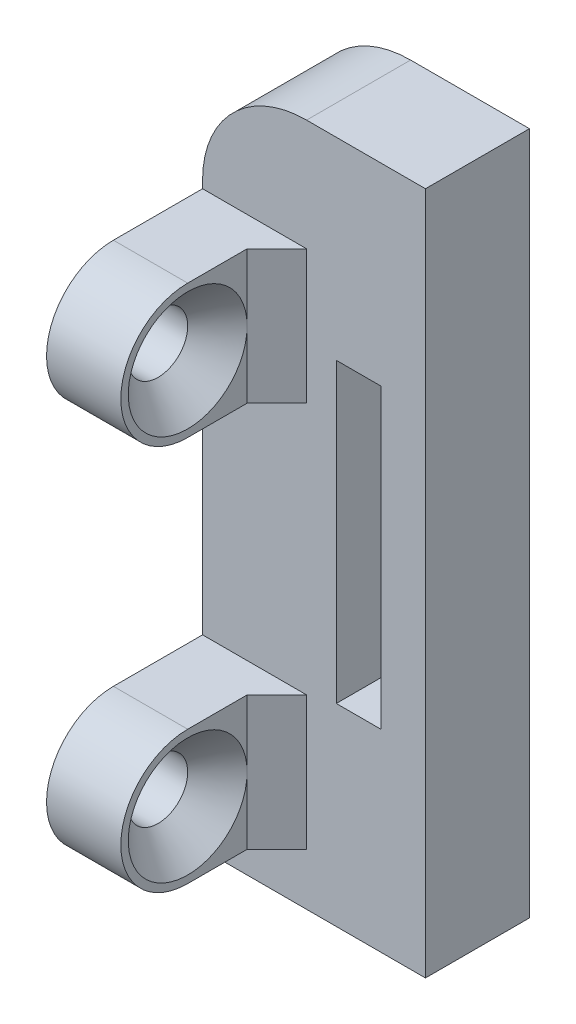
ISO-10303-21;
HEADER;
FILE_DESCRIPTION(('STEP AP214'),'2;1');
FILE_NAME('part.step','',(''),(''),'','','');
FILE_SCHEMA(('AUTOMOTIVE_DESIGN { 1 0 10303 214 1 1 1 1 }'));
ENDSEC;
DATA;
#1=APPLICATION_CONTEXT('core data for automotive mechanical design processes');
#2=APPLICATION_PROTOCOL_DEFINITION('international standard','automotive_design',2000,#1);
#3=PRODUCT_CONTEXT('',#1,'mechanical');
#4=PRODUCT('Part','Part','',(#3));
#5=PRODUCT_RELATED_PRODUCT_CATEGORY('part','',(#4));
#6=PRODUCT_DEFINITION_FORMATION('','',#4);
#7=PRODUCT_DEFINITION_CONTEXT('part definition',#1,'design');
#8=PRODUCT_DEFINITION('design','',#6,#7);
#9=PRODUCT_DEFINITION_SHAPE('','',#8);
#10=(LENGTH_UNIT() NAMED_UNIT(*) SI_UNIT(.MILLI.,.METRE.));
#11=(NAMED_UNIT(*) PLANE_ANGLE_UNIT() SI_UNIT($,.RADIAN.));
#12=(NAMED_UNIT(*) SI_UNIT($,.STERADIAN.) SOLID_ANGLE_UNIT());
#13=UNCERTAINTY_MEASURE_WITH_UNIT(LENGTH_MEASURE(1.E-05),#10,'distance_accuracy_value','');
#14=(GEOMETRIC_REPRESENTATION_CONTEXT(3) GLOBAL_UNCERTAINTY_ASSIGNED_CONTEXT((#13)) GLOBAL_UNIT_ASSIGNED_CONTEXT((#10,
#11,#12)) REPRESENTATION_CONTEXT('',''));
#15=CARTESIAN_POINT('',(0.,0.,0.));
#16=DIRECTION('',(0.,0.,1.));
#17=DIRECTION('',(1.,0.,0.));
#18=AXIS2_PLACEMENT_3D('',#15,#16,#17);
#19=CARTESIAN_POINT('',(14.,14.,7.));
#20=DIRECTION('',(0.,0.,1.));
#21=DIRECTION('',(1.,0.,0.));
#22=AXIS2_PLACEMENT_3D('',#19,#20,#21);
#23=PLANE('',#22);
#24=DIRECTION('',(0.,1.,0.));
#25=VECTOR('',#24,1.);
#26=CARTESIAN_POINT('',(19.,14.,7.));
#27=LINE('',#26,#25);
#28=CARTESIAN_POINT('',(19.,-12.,7.));
#29=VERTEX_POINT('',#28);
#30=CARTESIAN_POINT('',(19.,7.99999999999996,7.));
#31=VERTEX_POINT('',#30);
#32=EDGE_CURVE('E218',#29,#31,#27,.T.);
#33=ORIENTED_EDGE('',*,*,#32,.F.);
#34=DIRECTION('',(1.,0.,0.));
#35=VECTOR('',#34,1.);
#36=CARTESIAN_POINT('',(14.,-12.,7.));
#37=LINE('',#36,#35);
#38=CARTESIAN_POINT('',(16.,-12.,7.));
#39=VERTEX_POINT('',#38);
#40=EDGE_CURVE('E211',#39,#29,#37,.T.);
#41=ORIENTED_EDGE('',*,*,#40,.F.);
#42=DIRECTION('',(0.,-1.,0.));
#43=VECTOR('',#42,1.);
#44=CARTESIAN_POINT('',(16.,14.,7.));
#45=LINE('',#44,#43);
#46=CARTESIAN_POINT('',(16.,7.99999999999996,7.));
#47=VERTEX_POINT('',#46);
#48=EDGE_CURVE('E191',#47,#39,#45,.T.);
#49=ORIENTED_EDGE('',*,*,#48,.F.);
#50=DIRECTION('',(-1.,0.,0.));
#51=VECTOR('',#50,1.);
#52=CARTESIAN_POINT('',(14.,7.99999999999996,7.));
#53=LINE('',#52,#51);
#54=EDGE_CURVE('E216',#31,#47,#53,.T.);
#55=ORIENTED_EDGE('',*,*,#54,.F.);
#56=EDGE_LOOP('',(#33,#41,#49,#55));
#57=FACE_BOUND('',#56,.T.);
#58=DIRECTION('',(-1.,0.,0.));
#59=VECTOR('',#58,1.);
#60=CARTESIAN_POINT('',(12.,-12.5000000000001,7.));
#61=LINE('',#60,#59);
#62=CARTESIAN_POINT('',(14.,-12.5000000000001,7.));
#63=VERTEX_POINT('',#62);
#64=CARTESIAN_POINT('',(6.99999999999999,-12.5000000000001,7.));
#65=VERTEX_POINT('',#64);
#66=EDGE_CURVE('E237',#63,#65,#61,.T.);
#67=ORIENTED_EDGE('',*,*,#66,.F.);
#68=DIRECTION('',(0.,-1.,0.));
#69=VECTOR('',#68,1.);
#70=CARTESIAN_POINT('',(14.,-21.5000000000001,7.));
#71=LINE('',#70,#69);
#72=CARTESIAN_POINT('',(14.,-21.5000000000001,7.));
#73=VERTEX_POINT('',#72);
#74=EDGE_CURVE('E337',#63,#73,#71,.T.);
#75=ORIENTED_EDGE('',*,*,#74,.T.);
#76=DIRECTION('',(-1.,0.,0.));
#77=VECTOR('',#76,1.);
#78=CARTESIAN_POINT('',(12.,-21.5000000000001,7.));
#79=LINE('',#78,#77);
#80=CARTESIAN_POINT('',(6.99999999999999,-21.5000000000001,7.));
#81=VERTEX_POINT('',#80);
#82=EDGE_CURVE('E232',#73,#81,#79,.T.);
#83=ORIENTED_EDGE('',*,*,#82,.T.);
#84=DIRECTION('',(0.,-1.,0.));
#85=VECTOR('',#84,1.);
#86=CARTESIAN_POINT('',(6.99999999999999,13.9999999999999,7.));
#87=LINE('',#86,#85);
#88=CARTESIAN_POINT('',(6.99999999999999,-25.,7.));
#89=VERTEX_POINT('',#88);
#90=EDGE_CURVE('E286',#81,#89,#87,.T.);
#91=ORIENTED_EDGE('',*,*,#90,.T.);
#92=DIRECTION('',(1.,0.,0.));
#93=VECTOR('',#92,1.);
#94=CARTESIAN_POINT('',(6.99999999999999,-25.,7.));
#95=LINE('',#94,#93);
#96=CARTESIAN_POINT('',(22.,-25.,7.));
#97=VERTEX_POINT('',#96);
#98=EDGE_CURVE('E290',#89,#97,#95,.T.);
#99=ORIENTED_EDGE('',*,*,#98,.T.);
#100=DIRECTION('',(0.,1.,0.));
#101=VECTOR('',#100,1.);
#102=CARTESIAN_POINT('',(22.,-25.,7.));
#103=LINE('',#102,#101);
#104=CARTESIAN_POINT('',(22.,21.,7.));
#105=VERTEX_POINT('',#104);
#106=EDGE_CURVE('E278',#97,#105,#103,.T.);
#107=ORIENTED_EDGE('',*,*,#106,.T.);
#108=DIRECTION('',(-1.,0.,0.));
#109=VECTOR('',#108,1.);
#110=CARTESIAN_POINT('',(22.,21.,7.));
#111=LINE('',#110,#109);
#112=CARTESIAN_POINT('',(14.,21.,7.));
#113=VERTEX_POINT('',#112);
#114=EDGE_CURVE('E281',#105,#113,#111,.T.);
#115=ORIENTED_EDGE('',*,*,#114,.T.);
#116=CARTESIAN_POINT('',(14.,14.,7.));
#117=DIRECTION('',(0.,0.,1.));
#118=DIRECTION('',(1.,0.,0.));
#119=AXIS2_PLACEMENT_3D('',#116,#117,#118);
#120=CIRCLE('',#119,7.00000000000001);
#121=CARTESIAN_POINT('',(6.99999999999999,13.9999999999999,7.));
#122=VERTEX_POINT('',#121);
#123=EDGE_CURVE('E284',#113,#122,#120,.T.);
#124=ORIENTED_EDGE('',*,*,#123,.T.);
#125=CARTESIAN_POINT('',(6.99999999999999,13.4999999999999,7.));
#126=VERTEX_POINT('',#125);
#127=EDGE_CURVE('E287',#122,#126,#87,.T.);
#128=ORIENTED_EDGE('',*,*,#127,.T.);
#129=DIRECTION('',(-1.,0.,0.));
#130=VECTOR('',#129,1.);
#131=CARTESIAN_POINT('',(12.,13.4999999999999,7.));
#132=LINE('',#131,#130);
#133=CARTESIAN_POINT('',(14.,13.4999999999999,7.));
#134=VERTEX_POINT('',#133);
#135=EDGE_CURVE('E269',#134,#126,#132,.T.);
#136=ORIENTED_EDGE('',*,*,#135,.F.);
#137=DIRECTION('',(0.,-1.,0.));
#138=VECTOR('',#137,1.);
#139=CARTESIAN_POINT('',(14.,4.49999999999993,7.));
#140=LINE('',#139,#138);
#141=CARTESIAN_POINT('',(14.,4.49999999999993,7.));
#142=VERTEX_POINT('',#141);
#143=EDGE_CURVE('E334',#134,#142,#140,.T.);
#144=ORIENTED_EDGE('',*,*,#143,.T.);
#145=DIRECTION('',(-1.,0.,0.));
#146=VECTOR('',#145,1.);
#147=CARTESIAN_POINT('',(12.,4.49999999999993,7.));
#148=LINE('',#147,#146);
#149=CARTESIAN_POINT('',(6.99999999999999,4.49999999999993,7.));
#150=VERTEX_POINT('',#149);
#151=EDGE_CURVE('E261',#142,#150,#148,.T.);
#152=ORIENTED_EDGE('',*,*,#151,.T.);
#153=EDGE_CURVE('E291',#150,#65,#87,.T.);
#154=ORIENTED_EDGE('',*,*,#153,.T.);
#155=EDGE_LOOP('',(#67,#75,#83,#91,#99,#107,#115,#124,#128,#136,#144,#152,#154));
#156=FACE_BOUND('',#155,.T.);
#157=ADVANCED_FACE('F47',(#57,#156),#23,.T.);
#158=CARTESIAN_POINT('',(22.,-25.,7.));
#159=DIRECTION('',(-1.,0.,0.));
#160=DIRECTION('',(0.,0.,1.));
#161=AXIS2_PLACEMENT_3D('',#158,#159,#160);
#162=PLANE('',#161);
#163=DIRECTION('',(0.,1.,0.));
#164=VECTOR('',#163,1.);
#165=CARTESIAN_POINT('',(22.,-25.,0.));
#166=LINE('',#165,#164);
#167=CARTESIAN_POINT('',(22.,-25.,0.));
#168=VERTEX_POINT('',#167);
#169=CARTESIAN_POINT('',(22.,21.,0.));
#170=VERTEX_POINT('',#169);
#171=EDGE_CURVE('E271',#168,#170,#166,.T.);
#172=ORIENTED_EDGE('',*,*,#171,.T.);
#173=DIRECTION('',(0.,0.,-1.));
#174=VECTOR('',#173,1.);
#175=CARTESIAN_POINT('',(22.,21.,7.));
#176=LINE('',#175,#174);
#177=EDGE_CURVE('E314',#105,#170,#176,.T.);
#178=ORIENTED_EDGE('',*,*,#177,.F.);
#179=ORIENTED_EDGE('',*,*,#106,.F.);
#180=DIRECTION('',(0.,0.,-1.));
#181=VECTOR('',#180,1.);
#182=CARTESIAN_POINT('',(22.,-25.,7.));
#183=LINE('',#182,#181);
#184=EDGE_CURVE('E293',#97,#168,#183,.T.);
#185=ORIENTED_EDGE('',*,*,#184,.T.);
#186=EDGE_LOOP('',(#172,#178,#179,#185));
#187=FACE_BOUND('',#186,.T.);
#188=ADVANCED_FACE('F389',(#187),#162,.F.);
#189=CARTESIAN_POINT('',(22.,21.,7.));
#190=DIRECTION('',(0.,-1.,0.));
#191=DIRECTION('',(0.,0.,-1.));
#192=AXIS2_PLACEMENT_3D('',#189,#190,#191);
#193=PLANE('',#192);
#194=DIRECTION('',(-1.,0.,0.));
#195=VECTOR('',#194,1.);
#196=CARTESIAN_POINT('',(22.,21.,0.));
#197=LINE('',#196,#195);
#198=CARTESIAN_POINT('',(14.,21.,0.));
#199=VERTEX_POINT('',#198);
#200=EDGE_CURVE('E296',#170,#199,#197,.T.);
#201=ORIENTED_EDGE('',*,*,#200,.T.);
#202=DIRECTION('',(0.,0.,-1.));
#203=VECTOR('',#202,1.);
#204=CARTESIAN_POINT('',(14.,21.,7.));
#205=LINE('',#204,#203);
#206=EDGE_CURVE('E311',#113,#199,#205,.T.);
#207=ORIENTED_EDGE('',*,*,#206,.F.);
#208=ORIENTED_EDGE('',*,*,#114,.F.);
#209=ORIENTED_EDGE('',*,*,#177,.T.);
#210=EDGE_LOOP('',(#201,#207,#208,#209));
#211=FACE_BOUND('',#210,.T.);
#212=ADVANCED_FACE('F394',(#211),#193,.F.);
#213=CARTESIAN_POINT('',(14.,14.,7.));
#214=DIRECTION('',(0.,0.,-1.));
#215=DIRECTION('',(-1.,0.,0.));
#216=AXIS2_PLACEMENT_3D('',#213,#214,#215);
#217=CYLINDRICAL_SURFACE('',#216,7.00000000000001);
#218=CARTESIAN_POINT('',(14.,14.,0.));
#219=DIRECTION('',(0.,0.,1.));
#220=DIRECTION('',(1.,0.,0.));
#221=AXIS2_PLACEMENT_3D('',#218,#219,#220);
#222=CIRCLE('',#221,7.00000000000001);
#223=CARTESIAN_POINT('',(6.99999999999999,13.9999999999999,0.));
#224=VERTEX_POINT('',#223);
#225=EDGE_CURVE('E298',#199,#224,#222,.T.);
#226=ORIENTED_EDGE('',*,*,#225,.T.);
#227=DIRECTION('',(0.,0.,-1.));
#228=VECTOR('',#227,1.);
#229=CARTESIAN_POINT('',(6.99999999999999,13.9999999999999,7.));
#230=LINE('',#229,#228);
#231=EDGE_CURVE('E308',#122,#224,#230,.T.);
#232=ORIENTED_EDGE('',*,*,#231,.F.);
#233=ORIENTED_EDGE('',*,*,#123,.F.);
#234=ORIENTED_EDGE('',*,*,#206,.T.);
#235=EDGE_LOOP('',(#226,#232,#233,#234));
#236=FACE_BOUND('',#235,.T.);
#237=ADVANCED_FACE('F397',(#236),#217,.T.);
#238=CARTESIAN_POINT('',(6.99999999999999,13.9999999999999,7.));
#239=DIRECTION('',(1.,0.,0.));
#240=DIRECTION('',(0.,1.,0.));
#241=AXIS2_PLACEMENT_3D('',#238,#239,#240);
#242=PLANE('',#241);
#243=DIRECTION('',(0.,-1.,0.));
#244=VECTOR('',#243,1.);
#245=CARTESIAN_POINT('',(6.99999999999999,13.9999999999999,0.));
#246=LINE('',#245,#244);
#247=CARTESIAN_POINT('',(6.99999999999999,-25.,0.));
#248=VERTEX_POINT('',#247);
#249=EDGE_CURVE('E300',#224,#248,#246,.T.);
#250=ORIENTED_EDGE('',*,*,#249,.T.);
#251=DIRECTION('',(0.,0.,-1.));
#252=VECTOR('',#251,1.);
#253=CARTESIAN_POINT('',(6.99999999999999,-25.,7.));
#254=LINE('',#253,#252);
#255=EDGE_CURVE('E305',#89,#248,#254,.T.);
#256=ORIENTED_EDGE('',*,*,#255,.F.);
#257=ORIENTED_EDGE('',*,*,#90,.F.);
#258=DIRECTION('',(0.,0.,-1.));
#259=VECTOR('',#258,1.);
#260=CARTESIAN_POINT('',(6.99999999999999,-21.5000000000001,7.));
#261=LINE('',#260,#259);
#262=CARTESIAN_POINT('',(6.99999999999999,-21.5000000000001,13.));
#263=VERTEX_POINT('',#262);
#264=EDGE_CURVE('E223',#263,#81,#261,.T.);
#265=ORIENTED_EDGE('',*,*,#264,.F.);
#266=CARTESIAN_POINT('',(6.99999999999999,-17.0000000000001,13.));
#267=DIRECTION('',(1.,0.,0.));
#268=DIRECTION('',(0.,-1.,0.));
#269=AXIS2_PLACEMENT_3D('',#266,#267,#268);
#270=CIRCLE('',#269,4.5);
#271=CARTESIAN_POINT('',(6.99999999999999,-12.5000000000001,13.));
#272=VERTEX_POINT('',#271);
#273=EDGE_CURVE('E234',#272,#263,#270,.T.);
#274=ORIENTED_EDGE('',*,*,#273,.F.);
#275=DIRECTION('',(0.,0.,1.));
#276=VECTOR('',#275,1.);
#277=CARTESIAN_POINT('',(6.99999999999999,-12.5000000000001,7.));
#278=LINE('',#277,#276);
#279=EDGE_CURVE('E228',#65,#272,#278,.T.);
#280=ORIENTED_EDGE('',*,*,#279,.F.);
#281=ORIENTED_EDGE('',*,*,#153,.F.);
#282=DIRECTION('',(0.,0.,1.));
#283=VECTOR('',#282,1.);
#284=CARTESIAN_POINT('',(6.99999999999999,4.49999999999993,7.));
#285=LINE('',#284,#283);
#286=CARTESIAN_POINT('',(6.99999999999999,4.49999999999993,13.));
#287=VERTEX_POINT('',#286);
#288=EDGE_CURVE('E251',#150,#287,#285,.T.);
#289=ORIENTED_EDGE('',*,*,#288,.T.);
#290=CARTESIAN_POINT('',(6.99999999999999,8.99999999999993,13.));
#291=DIRECTION('',(-1.,0.,0.));
#292=DIRECTION('',(0.,1.,0.));
#293=AXIS2_PLACEMENT_3D('',#290,#291,#292);
#294=CIRCLE('',#293,4.5);
#295=CARTESIAN_POINT('',(6.99999999999999,13.4999999999999,13.));
#296=VERTEX_POINT('',#295);
#297=EDGE_CURVE('E264',#287,#296,#294,.T.);
#298=ORIENTED_EDGE('',*,*,#297,.T.);
#299=DIRECTION('',(0.,0.,-1.));
#300=VECTOR('',#299,1.);
#301=CARTESIAN_POINT('',(6.99999999999999,13.4999999999999,7.));
#302=LINE('',#301,#300);
#303=EDGE_CURVE('E255',#296,#126,#302,.T.);
#304=ORIENTED_EDGE('',*,*,#303,.T.);
#305=ORIENTED_EDGE('',*,*,#127,.F.);
#306=ORIENTED_EDGE('',*,*,#231,.T.);
#307=EDGE_LOOP('',(#250,#256,#257,#265,#274,#280,#281,#289,#298,#304,#305,#306));
#308=FACE_BOUND('',#307,.T.);
#309=CARTESIAN_POINT('',(6.99999999999999,8.99999999999993,13.));
#310=DIRECTION('',(-1.,0.,0.));
#311=DIRECTION('',(0.,-1.,0.));
#312=AXIS2_PLACEMENT_3D('',#309,#310,#311);
#313=CIRCLE('',#312,2.);
#314=CARTESIAN_POINT('',(6.99999999999999,6.99999999999993,13.));
#315=VERTEX_POINT('',#314);
#316=EDGE_CURVE('E240',#315,#315,#313,.T.);
#317=ORIENTED_EDGE('',*,*,#316,.F.);
#318=EDGE_LOOP('',(#317));
#319=FACE_BOUND('',#318,.T.);
#320=CARTESIAN_POINT('',(6.99999999999999,-17.0000000000001,13.));
#321=DIRECTION('',(1.,0.,0.));
#322=DIRECTION('',(0.,1.,0.));
#323=AXIS2_PLACEMENT_3D('',#320,#321,#322);
#324=CIRCLE('',#323,2.);
#325=CARTESIAN_POINT('',(6.99999999999999,-15.0000000000001,13.));
#326=VERTEX_POINT('',#325);
#327=EDGE_CURVE('E220',#326,#326,#324,.T.);
#328=ORIENTED_EDGE('',*,*,#327,.T.);
#329=EDGE_LOOP('',(#328));
#330=FACE_BOUND('',#329,.T.);
#331=ADVANCED_FACE('F373',(#308,#319,#330),#242,.F.);
#332=CARTESIAN_POINT('',(6.99999999999999,-25.,7.));
#333=DIRECTION('',(0.,1.,0.));
#334=DIRECTION('',(0.,0.,1.));
#335=AXIS2_PLACEMENT_3D('',#332,#333,#334);
#336=PLANE('',#335);
#337=DIRECTION('',(1.,0.,0.));
#338=VECTOR('',#337,1.);
#339=CARTESIAN_POINT('',(6.99999999999999,-25.,0.));
#340=LINE('',#339,#338);
#341=EDGE_CURVE('E282',#248,#168,#340,.T.);
#342=ORIENTED_EDGE('',*,*,#341,.T.);
#343=ORIENTED_EDGE('',*,*,#184,.F.);
#344=ORIENTED_EDGE('',*,*,#98,.F.);
#345=ORIENTED_EDGE('',*,*,#255,.T.);
#346=EDGE_LOOP('',(#342,#343,#344,#345));
#347=FACE_BOUND('',#346,.T.);
#348=ADVANCED_FACE('F384',(#347),#336,.F.);
#349=CARTESIAN_POINT('',(14.,14.,0.));
#350=DIRECTION('',(0.,0.,1.));
#351=DIRECTION('',(1.,0.,0.));
#352=AXIS2_PLACEMENT_3D('',#349,#350,#351);
#353=PLANE('',#352);
#354=DIRECTION('',(-1.,0.,0.));
#355=VECTOR('',#354,1.);
#356=CARTESIAN_POINT('',(19.,-12.,0.));
#357=LINE('',#356,#355);
#358=CARTESIAN_POINT('',(19.,-12.,0.));
#359=VERTEX_POINT('',#358);
#360=CARTESIAN_POINT('',(16.,-12.,0.));
#361=VERTEX_POINT('',#360);
#362=EDGE_CURVE('E197',#359,#361,#357,.T.);
#363=ORIENTED_EDGE('',*,*,#362,.F.);
#364=DIRECTION('',(0.,-1.,0.));
#365=VECTOR('',#364,1.);
#366=CARTESIAN_POINT('',(19.,-12.,0.));
#367=LINE('',#366,#365);
#368=CARTESIAN_POINT('',(19.,7.99999999999996,0.));
#369=VERTEX_POINT('',#368);
#370=EDGE_CURVE('E71',#369,#359,#367,.T.);
#371=ORIENTED_EDGE('',*,*,#370,.F.);
#372=DIRECTION('',(1.,0.,0.));
#373=VECTOR('',#372,1.);
#374=CARTESIAN_POINT('',(19.,7.99999999999996,0.));
#375=LINE('',#374,#373);
#376=CARTESIAN_POINT('',(16.,7.99999999999996,0.));
#377=VERTEX_POINT('',#376);
#378=EDGE_CURVE('E204',#377,#369,#375,.T.);
#379=ORIENTED_EDGE('',*,*,#378,.F.);
#380=DIRECTION('',(0.,1.,0.));
#381=VECTOR('',#380,1.);
#382=CARTESIAN_POINT('',(16.,-12.,0.));
#383=LINE('',#382,#381);
#384=EDGE_CURVE('E188',#361,#377,#383,.T.);
#385=ORIENTED_EDGE('',*,*,#384,.F.);
#386=EDGE_LOOP('',(#363,#371,#379,#385));
#387=FACE_BOUND('',#386,.T.);
#388=ORIENTED_EDGE('',*,*,#171,.F.);
#389=ORIENTED_EDGE('',*,*,#341,.F.);
#390=ORIENTED_EDGE('',*,*,#249,.F.);
#391=ORIENTED_EDGE('',*,*,#225,.F.);
#392=ORIENTED_EDGE('',*,*,#200,.F.);
#393=EDGE_LOOP('',(#388,#389,#390,#391,#392));
#394=FACE_BOUND('',#393,.T.);
#395=ADVANCED_FACE('F201',(#387,#394),#353,.F.);
#396=CARTESIAN_POINT('',(12.,13.4999999999999,7.));
#397=DIRECTION('',(0.,1.,0.));
#398=DIRECTION('',(0.,0.,1.));
#399=AXIS2_PLACEMENT_3D('',#396,#397,#398);
#400=PLANE('',#399);
#401=ORIENTED_EDGE('',*,*,#303,.F.);
#402=DIRECTION('',(-1.,0.,0.));
#403=VECTOR('',#402,1.);
#404=CARTESIAN_POINT('',(12.,13.4999999999999,13.));
#405=LINE('',#404,#403);
#406=CARTESIAN_POINT('',(12.,13.4999999999999,13.));
#407=VERTEX_POINT('',#406);
#408=EDGE_CURVE('E272',#407,#296,#405,.T.);
#409=ORIENTED_EDGE('',*,*,#408,.F.);
#410=DIRECTION('',(0.,0.,-1.));
#411=VECTOR('',#410,1.);
#412=CARTESIAN_POINT('',(12.,13.4999999999999,7.));
#413=LINE('',#412,#411);
#414=CARTESIAN_POINT('',(12.,13.4999999999999,8.99999999999999));
#415=VERTEX_POINT('',#414);
#416=EDGE_CURVE('E258',#407,#415,#413,.T.);
#417=ORIENTED_EDGE('',*,*,#416,.T.);
#418=DIRECTION('',(-0.707106781186551,0.,0.707106781186544));
#419=VECTOR('',#418,1.);
#420=CARTESIAN_POINT('',(14.,13.4999999999999,7.));
#421=LINE('',#420,#419);
#422=EDGE_CURVE('E13',#415,#134,#421,.F.);
#423=ORIENTED_EDGE('',*,*,#422,.T.);
#424=ORIENTED_EDGE('',*,*,#135,.T.);
#425=EDGE_LOOP('',(#401,#409,#417,#423,#424));
#426=FACE_BOUND('',#425,.T.);
#427=ADVANCED_FACE('F365',(#426),#400,.T.);
#428=CARTESIAN_POINT('',(12.,8.99999999999993,13.));
#429=DIRECTION('',(-1.,0.,0.));
#430=DIRECTION('',(0.,-1.,0.));
#431=AXIS2_PLACEMENT_3D('',#428,#429,#430);
#432=CYLINDRICAL_SURFACE('',#431,4.5);
#433=ORIENTED_EDGE('',*,*,#297,.F.);
#434=DIRECTION('',(-1.,0.,0.));
#435=VECTOR('',#434,1.);
#436=CARTESIAN_POINT('',(12.,4.49999999999993,13.));
#437=LINE('',#436,#435);
#438=CARTESIAN_POINT('',(12.,4.49999999999993,13.));
#439=VERTEX_POINT('',#438);
#440=EDGE_CURVE('E274',#439,#287,#437,.T.);
#441=ORIENTED_EDGE('',*,*,#440,.F.);
#442=CARTESIAN_POINT('',(12.,8.99999999999993,13.));
#443=DIRECTION('',(-1.,0.,0.));
#444=DIRECTION('',(0.,1.,0.));
#445=AXIS2_PLACEMENT_3D('',#442,#443,#444);
#446=CIRCLE('',#445,4.5);
#447=EDGE_CURVE('E254',#439,#407,#446,.T.);
#448=ORIENTED_EDGE('',*,*,#447,.T.);
#449=ORIENTED_EDGE('',*,*,#408,.T.);
#450=EDGE_LOOP('',(#433,#441,#448,#449));
#451=FACE_BOUND('',#450,.T.);
#452=ADVANCED_FACE('F368',(#451),#432,.T.);
#453=CARTESIAN_POINT('',(12.,4.49999999999993,7.));
#454=DIRECTION('',(0.,-1.,0.));
#455=DIRECTION('',(1.,0.,0.));
#456=AXIS2_PLACEMENT_3D('',#453,#454,#455);
#457=PLANE('',#456);
#458=ORIENTED_EDGE('',*,*,#288,.F.);
#459=ORIENTED_EDGE('',*,*,#151,.F.);
#460=DIRECTION('',(0.707106781186551,0.,-0.707106781186544));
#461=VECTOR('',#460,1.);
#462=CARTESIAN_POINT('',(14.,4.49999999999993,7.));
#463=LINE('',#462,#461);
#464=CARTESIAN_POINT('',(12.,4.49999999999993,8.99999999999999));
#465=VERTEX_POINT('',#464);
#466=EDGE_CURVE('E56',#142,#465,#463,.F.);
#467=ORIENTED_EDGE('',*,*,#466,.T.);
#468=DIRECTION('',(0.,0.,1.));
#469=VECTOR('',#468,1.);
#470=CARTESIAN_POINT('',(12.,4.49999999999993,7.));
#471=LINE('',#470,#469);
#472=EDGE_CURVE('E252',#465,#439,#471,.T.);
#473=ORIENTED_EDGE('',*,*,#472,.T.);
#474=ORIENTED_EDGE('',*,*,#440,.T.);
#475=EDGE_LOOP('',(#458,#459,#467,#473,#474));
#476=FACE_BOUND('',#475,.T.);
#477=ADVANCED_FACE('F351',(#476),#457,.T.);
#478=CARTESIAN_POINT('',(12.,8.99999999999993,13.));
#479=DIRECTION('',(1.,0.,0.));
#480=DIRECTION('',(0.,1.,0.));
#481=AXIS2_PLACEMENT_3D('',#478,#479,#480);
#482=PLANE('',#481);
#483=ORIENTED_EDGE('',*,*,#472,.F.);
#484=DIRECTION('',(0.,1.,0.));
#485=VECTOR('',#484,1.);
#486=CARTESIAN_POINT('',(12.,13.4999999999999,8.99999999999999));
#487=LINE('',#486,#485);
#488=CARTESIAN_POINT('',(12.,8.99999999999993,8.99999999999999));
#489=VERTEX_POINT('',#488);
#490=EDGE_CURVE('E342',#465,#489,#487,.T.);
#491=ORIENTED_EDGE('',*,*,#490,.T.);
#492=CARTESIAN_POINT('',(12.,8.99999999999993,13.));
#493=DIRECTION('',(1.,0.,0.));
#494=DIRECTION('',(0.,1.,0.));
#495=AXIS2_PLACEMENT_3D('',#492,#493,#494);
#496=CIRCLE('',#495,4.00000000000001);
#497=EDGE_CURVE('E323',#489,#489,#496,.F.);
#498=ORIENTED_EDGE('',*,*,#497,.T.);
#499=DIRECTION('',(0.,1.,0.));
#500=VECTOR('',#499,1.);
#501=CARTESIAN_POINT('',(12.,13.4999999999999,8.99999999999999));
#502=LINE('',#501,#500);
#503=EDGE_CURVE('E340',#489,#415,#502,.T.);
#504=ORIENTED_EDGE('',*,*,#503,.T.);
#505=ORIENTED_EDGE('',*,*,#416,.F.);
#506=ORIENTED_EDGE('',*,*,#447,.F.);
#507=EDGE_LOOP('',(#483,#491,#498,#504,#505,#506));
#508=FACE_BOUND('',#507,.T.);
#509=ADVANCED_FACE('F358',(#508),#482,.T.);
#510=CARTESIAN_POINT('',(12.,8.99999999999993,13.));
#511=DIRECTION('',(-1.,0.,0.));
#512=DIRECTION('',(0.,-1.,0.));
#513=AXIS2_PLACEMENT_3D('',#510,#511,#512);
#514=CYLINDRICAL_SURFACE('',#513,2.);
#515=CARTESIAN_POINT('',(9.99999999999997,8.99999999999993,13.));
#516=DIRECTION('',(1.,0.,0.));
#517=DIRECTION('',(0.,0.,-1.));
#518=AXIS2_PLACEMENT_3D('',#515,#516,#517);
#519=CIRCLE('',#518,2.);
#520=CARTESIAN_POINT('',(9.99999999999997,8.99999999999993,11.));
#521=VERTEX_POINT('',#520);
#522=EDGE_CURVE('E326',#521,#521,#519,.T.);
#523=ORIENTED_EDGE('',*,*,#522,.T.);
#524=EDGE_LOOP('',(#523));
#525=FACE_BOUND('',#524,.T.);
#526=ORIENTED_EDGE('',*,*,#316,.T.);
#527=EDGE_LOOP('',(#526));
#528=FACE_BOUND('',#527,.T.);
#529=ADVANCED_FACE('F422',(#525,#528),#514,.F.);
#530=CARTESIAN_POINT('',(12.,-17.0000000000001,13.));
#531=DIRECTION('',(1.,0.,0.));
#532=DIRECTION('',(0.,-1.,0.));
#533=AXIS2_PLACEMENT_3D('',#530,#531,#532);
#534=PLANE('',#533);
#535=DIRECTION('',(0.,0.,-1.));
#536=VECTOR('',#535,1.);
#537=CARTESIAN_POINT('',(12.,-21.5000000000001,7.));
#538=LINE('',#537,#536);
#539=CARTESIAN_POINT('',(12.,-21.5000000000001,13.));
#540=VERTEX_POINT('',#539);
#541=CARTESIAN_POINT('',(12.,-21.5000000000001,9.00000000000001));
#542=VERTEX_POINT('',#541);
#543=EDGE_CURVE('E224',#540,#542,#538,.T.);
#544=ORIENTED_EDGE('',*,*,#543,.T.);
#545=DIRECTION('',(0.,1.,0.));
#546=VECTOR('',#545,1.);
#547=CARTESIAN_POINT('',(12.,-12.5000000000001,9.00000000000001));
#548=LINE('',#547,#546);
#549=CARTESIAN_POINT('',(12.,-17.0000000000001,9.00000000000001));
#550=VERTEX_POINT('',#549);
#551=EDGE_CURVE('E331',#542,#550,#548,.T.);
#552=ORIENTED_EDGE('',*,*,#551,.T.);
#553=CARTESIAN_POINT('',(12.,-17.0000000000001,13.));
#554=DIRECTION('',(1.,0.,0.));
#555=DIRECTION('',(0.,1.,0.));
#556=AXIS2_PLACEMENT_3D('',#553,#554,#555);
#557=CIRCLE('',#556,4.00000000000001);
#558=EDGE_CURVE('E320',#550,#550,#557,.F.);
#559=ORIENTED_EDGE('',*,*,#558,.T.);
#560=DIRECTION('',(0.,1.,0.));
#561=VECTOR('',#560,1.);
#562=CARTESIAN_POINT('',(12.,-12.5000000000001,9.00000000000001));
#563=LINE('',#562,#561);
#564=CARTESIAN_POINT('',(12.,-12.5000000000001,9.00000000000001));
#565=VERTEX_POINT('',#564);
#566=EDGE_CURVE('E329',#550,#565,#563,.T.);
#567=ORIENTED_EDGE('',*,*,#566,.T.);
#568=DIRECTION('',(0.,0.,1.));
#569=VECTOR('',#568,1.);
#570=CARTESIAN_POINT('',(12.,-12.5000000000001,7.));
#571=LINE('',#570,#569);
#572=CARTESIAN_POINT('',(12.,-12.5000000000001,13.));
#573=VERTEX_POINT('',#572);
#574=EDGE_CURVE('E230',#565,#573,#571,.T.);
#575=ORIENTED_EDGE('',*,*,#574,.T.);
#576=CARTESIAN_POINT('',(12.,-17.0000000000001,13.));
#577=DIRECTION('',(1.,0.,0.));
#578=DIRECTION('',(0.,-1.,0.));
#579=AXIS2_PLACEMENT_3D('',#576,#577,#578);
#580=CIRCLE('',#579,4.5);
#581=EDGE_CURVE('E227',#573,#540,#580,.T.);
#582=ORIENTED_EDGE('',*,*,#581,.T.);
#583=EDGE_LOOP('',(#544,#552,#559,#567,#575,#582));
#584=FACE_BOUND('',#583,.T.);
#585=ADVANCED_FACE('F425',(#584),#534,.T.);
#586=CARTESIAN_POINT('',(12.,-12.5000000000001,7.));
#587=DIRECTION('',(0.,-1.,0.));
#588=DIRECTION('',(0.,0.,-1.));
#589=AXIS2_PLACEMENT_3D('',#586,#587,#588);
#590=PLANE('',#589);
#591=ORIENTED_EDGE('',*,*,#279,.T.);
#592=DIRECTION('',(-1.,0.,0.));
#593=VECTOR('',#592,1.);
#594=CARTESIAN_POINT('',(12.,-12.5000000000001,13.));
#595=LINE('',#594,#593);
#596=EDGE_CURVE('E241',#573,#272,#595,.T.);
#597=ORIENTED_EDGE('',*,*,#596,.F.);
#598=ORIENTED_EDGE('',*,*,#574,.F.);
#599=DIRECTION('',(-0.707106781186546,0.,0.707106781186549));
#600=VECTOR('',#599,1.);
#601=CARTESIAN_POINT('',(13.,-12.5000000000001,8.));
#602=LINE('',#601,#600);
#603=EDGE_CURVE('E344',#565,#63,#602,.F.);
#604=ORIENTED_EDGE('',*,*,#603,.T.);
#605=ORIENTED_EDGE('',*,*,#66,.T.);
#606=EDGE_LOOP('',(#591,#597,#598,#604,#605));
#607=FACE_BOUND('',#606,.T.);
#608=ADVANCED_FACE('F435',(#607),#590,.F.);
#609=CARTESIAN_POINT('',(12.,-17.0000000000001,13.));
#610=DIRECTION('',(-1.,0.,0.));
#611=DIRECTION('',(0.,-1.,0.));
#612=AXIS2_PLACEMENT_3D('',#609,#610,#611);
#613=CYLINDRICAL_SURFACE('',#612,4.5);
#614=ORIENTED_EDGE('',*,*,#273,.T.);
#615=DIRECTION('',(-1.,0.,0.));
#616=VECTOR('',#615,1.);
#617=CARTESIAN_POINT('',(12.,-21.5000000000001,13.));
#618=LINE('',#617,#616);
#619=EDGE_CURVE('E244',#540,#263,#618,.T.);
#620=ORIENTED_EDGE('',*,*,#619,.F.);
#621=ORIENTED_EDGE('',*,*,#581,.F.);
#622=ORIENTED_EDGE('',*,*,#596,.T.);
#623=EDGE_LOOP('',(#614,#620,#621,#622));
#624=FACE_BOUND('',#623,.T.);
#625=ADVANCED_FACE('F431',(#624),#613,.T.);
#626=CARTESIAN_POINT('',(12.,-21.5000000000001,7.));
#627=DIRECTION('',(0.,1.,0.));
#628=DIRECTION('',(0.,0.,1.));
#629=AXIS2_PLACEMENT_3D('',#626,#627,#628);
#630=PLANE('',#629);
#631=ORIENTED_EDGE('',*,*,#264,.T.);
#632=ORIENTED_EDGE('',*,*,#82,.F.);
#633=DIRECTION('',(0.707106781186546,0.,-0.707106781186549));
#634=VECTOR('',#633,1.);
#635=CARTESIAN_POINT('',(13.,-21.5000000000001,8.));
#636=LINE('',#635,#634);
#637=EDGE_CURVE('E347',#73,#542,#636,.F.);
#638=ORIENTED_EDGE('',*,*,#637,.T.);
#639=ORIENTED_EDGE('',*,*,#543,.F.);
#640=ORIENTED_EDGE('',*,*,#619,.T.);
#641=EDGE_LOOP('',(#631,#632,#638,#639,#640));
#642=FACE_BOUND('',#641,.T.);
#643=ADVANCED_FACE('F427',(#642),#630,.F.);
#644=CARTESIAN_POINT('',(12.,-17.0000000000001,13.));
#645=DIRECTION('',(-1.,0.,0.));
#646=DIRECTION('',(0.,-1.,0.));
#647=AXIS2_PLACEMENT_3D('',#644,#645,#646);
#648=CYLINDRICAL_SURFACE('',#647,2.);
#649=CARTESIAN_POINT('',(9.99999999999999,-17.0000000000001,13.));
#650=DIRECTION('',(1.,0.,0.));
#651=DIRECTION('',(0.,0.,-1.));
#652=AXIS2_PLACEMENT_3D('',#649,#650,#651);
#653=CIRCLE('',#652,2.);
#654=CARTESIAN_POINT('',(9.99999999999999,-17.0000000000001,11.));
#655=VERTEX_POINT('',#654);
#656=EDGE_CURVE('E317',#655,#655,#653,.T.);
#657=ORIENTED_EDGE('',*,*,#656,.T.);
#658=EDGE_LOOP('',(#657));
#659=FACE_BOUND('',#658,.T.);
#660=ORIENTED_EDGE('',*,*,#327,.F.);
#661=EDGE_LOOP('',(#660));
#662=FACE_BOUND('',#661,.T.);
#663=ADVANCED_FACE('F430',(#659,#662),#648,.F.);
#664=CARTESIAN_POINT('',(9.99999999999999,-17.0000000000001,13.));
#665=DIRECTION('',(1.,0.,0.));
#666=DIRECTION('',(0.,0.,-1.));
#667=AXIS2_PLACEMENT_3D('',#664,#665,#666);
#668=CONICAL_SURFACE('',#667,2.,0.785398163397451);
#669=ORIENTED_EDGE('',*,*,#558,.F.);
#670=EDGE_LOOP('',(#669));
#671=FACE_BOUND('',#670,.T.);
#672=ORIENTED_EDGE('',*,*,#656,.F.);
#673=EDGE_LOOP('',(#672));
#674=FACE_BOUND('',#673,.T.);
#675=ADVANCED_FACE('F445',(#671,#674),#668,.F.);
#676=CARTESIAN_POINT('',(12.,8.99999999999993,13.));
#677=DIRECTION('',(1.,0.,0.));
#678=DIRECTION('',(0.,0.,-1.));
#679=AXIS2_PLACEMENT_3D('',#676,#677,#678);
#680=CONICAL_SURFACE('',#679,4.00000000000001,0.785398163397447);
#681=ORIENTED_EDGE('',*,*,#522,.F.);
#682=EDGE_LOOP('',(#681));
#683=FACE_BOUND('',#682,.T.);
#684=ORIENTED_EDGE('',*,*,#497,.F.);
#685=EDGE_LOOP('',(#684));
#686=FACE_BOUND('',#685,.T.);
#687=ADVANCED_FACE('F496',(#683,#686),#680,.F.);
#688=CARTESIAN_POINT('',(12.,-17.0000000000001,9.00000000000001));
#689=DIRECTION('',(0.707106781186549,0.,0.707106781186546));
#690=DIRECTION('',(0.,-1.,0.));
#691=AXIS2_PLACEMENT_3D('',#688,#689,#690);
#692=PLANE('',#691);
#693=ORIENTED_EDGE('',*,*,#637,.F.);
#694=ORIENTED_EDGE('',*,*,#74,.F.);
#695=ORIENTED_EDGE('',*,*,#603,.F.);
#696=ORIENTED_EDGE('',*,*,#566,.F.);
#697=ORIENTED_EDGE('',*,*,#551,.F.);
#698=EDGE_LOOP('',(#693,#694,#695,#696,#697));
#699=FACE_BOUND('',#698,.T.);
#700=ADVANCED_FACE('F489',(#699),#692,.T.);
#701=CARTESIAN_POINT('',(14.,14.,7.));
#702=DIRECTION('',(0.707106781186544,0.,0.707106781186551));
#703=DIRECTION('',(0.,1.,0.));
#704=AXIS2_PLACEMENT_3D('',#701,#702,#703);
#705=PLANE('',#704);
#706=ORIENTED_EDGE('',*,*,#503,.F.);
#707=ORIENTED_EDGE('',*,*,#490,.F.);
#708=ORIENTED_EDGE('',*,*,#466,.F.);
#709=ORIENTED_EDGE('',*,*,#143,.F.);
#710=ORIENTED_EDGE('',*,*,#422,.F.);
#711=EDGE_LOOP('',(#706,#707,#708,#709,#710));
#712=FACE_BOUND('',#711,.T.);
#713=ADVANCED_FACE('F50',(#712),#705,.T.);
#714=CARTESIAN_POINT('',(19.,-12.,17.5));
#715=DIRECTION('',(1.,0.,0.));
#716=DIRECTION('',(0.,1.,0.));
#717=AXIS2_PLACEMENT_3D('',#714,#715,#716);
#718=PLANE('',#717);
#719=ORIENTED_EDGE('',*,*,#32,.T.);
#720=DIRECTION('',(0.,0.,-1.));
#721=VECTOR('',#720,1.);
#722=CARTESIAN_POINT('',(19.,7.99999999999996,17.5));
#723=LINE('',#722,#721);
#724=EDGE_CURVE('E209',#31,#369,#723,.T.);
#725=ORIENTED_EDGE('',*,*,#724,.T.);
#726=ORIENTED_EDGE('',*,*,#370,.T.);
#727=DIRECTION('',(0.,0.,-1.));
#728=VECTOR('',#727,1.);
#729=CARTESIAN_POINT('',(19.,-12.,17.5));
#730=LINE('',#729,#728);
#731=EDGE_CURVE('E194',#29,#359,#730,.T.);
#732=ORIENTED_EDGE('',*,*,#731,.F.);
#733=EDGE_LOOP('',(#719,#725,#726,#732));
#734=FACE_BOUND('',#733,.T.);
#735=ADVANCED_FACE('F447',(#734),#718,.F.);
#736=CARTESIAN_POINT('',(19.,7.99999999999996,17.5));
#737=DIRECTION('',(0.,1.,0.));
#738=DIRECTION('',(0.,0.,1.));
#739=AXIS2_PLACEMENT_3D('',#736,#737,#738);
#740=PLANE('',#739);
#741=ORIENTED_EDGE('',*,*,#54,.T.);
#742=DIRECTION('',(0.,0.,-1.));
#743=VECTOR('',#742,1.);
#744=CARTESIAN_POINT('',(16.,7.99999999999996,17.5));
#745=LINE('',#744,#743);
#746=EDGE_CURVE('E193',#47,#377,#745,.T.);
#747=ORIENTED_EDGE('',*,*,#746,.T.);
#748=ORIENTED_EDGE('',*,*,#378,.T.);
#749=ORIENTED_EDGE('',*,*,#724,.F.);
#750=EDGE_LOOP('',(#741,#747,#748,#749));
#751=FACE_BOUND('',#750,.T.);
#752=ADVANCED_FACE('F450',(#751),#740,.F.);
#753=CARTESIAN_POINT('',(16.,-12.,17.5));
#754=DIRECTION('',(-1.,0.,0.));
#755=DIRECTION('',(0.,0.,1.));
#756=AXIS2_PLACEMENT_3D('',#753,#754,#755);
#757=PLANE('',#756);
#758=ORIENTED_EDGE('',*,*,#48,.T.);
#759=DIRECTION('',(0.,0.,-1.));
#760=VECTOR('',#759,1.);
#761=CARTESIAN_POINT('',(16.,-12.,17.5));
#762=LINE('',#761,#760);
#763=EDGE_CURVE('E63',#39,#361,#762,.T.);
#764=ORIENTED_EDGE('',*,*,#763,.T.);
#765=ORIENTED_EDGE('',*,*,#384,.T.);
#766=ORIENTED_EDGE('',*,*,#746,.F.);
#767=EDGE_LOOP('',(#758,#764,#765,#766));
#768=FACE_BOUND('',#767,.T.);
#769=ADVANCED_FACE('F185',(#768),#757,.F.);
#770=CARTESIAN_POINT('',(19.,-12.,17.5));
#771=DIRECTION('',(0.,-1.,0.));
#772=DIRECTION('',(0.,0.,-1.));
#773=AXIS2_PLACEMENT_3D('',#770,#771,#772);
#774=PLANE('',#773);
#775=ORIENTED_EDGE('',*,*,#40,.T.);
#776=ORIENTED_EDGE('',*,*,#731,.T.);
#777=ORIENTED_EDGE('',*,*,#362,.T.);
#778=ORIENTED_EDGE('',*,*,#763,.F.);
#779=EDGE_LOOP('',(#775,#776,#777,#778));
#780=FACE_BOUND('',#779,.T.);
#781=ADVANCED_FACE('F198',(#780),#774,.F.);
#782=CLOSED_SHELL('',(#157,#188,#212,#237,#331,#348,#395,#427,#452,#477,#509,#529,#585,#608,
#625,#643,#663,#675,#687,#700,#713,#735,#752,#769,#781));
#783=MANIFOLD_SOLID_BREP('B2',#782);
#784=ADVANCED_BREP_SHAPE_REPRESENTATION('',(#18,#783),#14);
#785=SHAPE_DEFINITION_REPRESENTATION(#9,#784);
ENDSEC;
END-ISO-10303-21;
